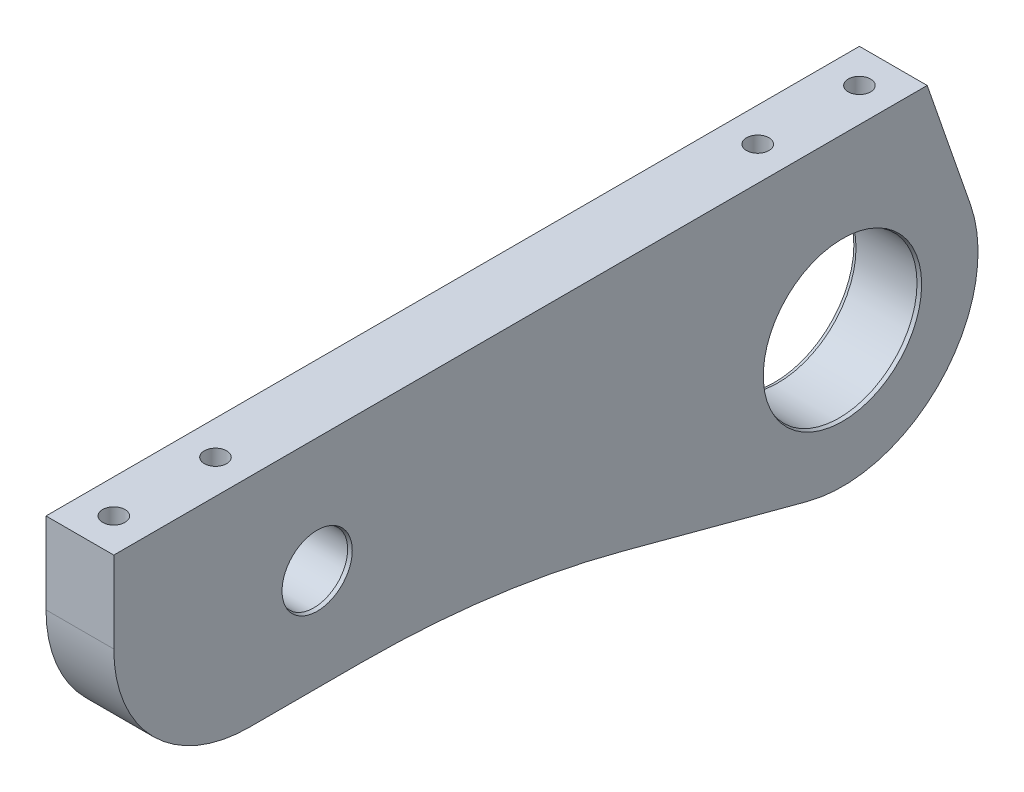
ISO-10303-21;
HEADER;
FILE_DESCRIPTION(('STEP AP214'),'2;1');
FILE_NAME('part.step','',(''),(''),'','','');
FILE_SCHEMA(('AUTOMOTIVE_DESIGN { 1 0 10303 214 1 1 1 1 }'));
ENDSEC;
DATA;
#1=APPLICATION_CONTEXT('core data for automotive mechanical design processes');
#2=APPLICATION_PROTOCOL_DEFINITION('international standard','automotive_design',2000,#1);
#3=PRODUCT_CONTEXT('',#1,'mechanical');
#4=PRODUCT('Part','Part','',(#3));
#5=PRODUCT_RELATED_PRODUCT_CATEGORY('part','',(#4));
#6=PRODUCT_DEFINITION_FORMATION('','',#4);
#7=PRODUCT_DEFINITION_CONTEXT('part definition',#1,'design');
#8=PRODUCT_DEFINITION('design','',#6,#7);
#9=PRODUCT_DEFINITION_SHAPE('','',#8);
#10=(LENGTH_UNIT() NAMED_UNIT(*) SI_UNIT(.MILLI.,.METRE.));
#11=(NAMED_UNIT(*) PLANE_ANGLE_UNIT() SI_UNIT($,.RADIAN.));
#12=(NAMED_UNIT(*) SI_UNIT($,.STERADIAN.) SOLID_ANGLE_UNIT());
#13=UNCERTAINTY_MEASURE_WITH_UNIT(LENGTH_MEASURE(1.E-05),#10,'distance_accuracy_value','');
#14=(GEOMETRIC_REPRESENTATION_CONTEXT(3) GLOBAL_UNCERTAINTY_ASSIGNED_CONTEXT((#13)) GLOBAL_UNIT_ASSIGNED_CONTEXT((#10,
#11,#12)) REPRESENTATION_CONTEXT('',''));
#15=CARTESIAN_POINT('',(0.,0.,0.));
#16=DIRECTION('',(0.,0.,1.));
#17=DIRECTION('',(1.,0.,0.));
#18=AXIS2_PLACEMENT_3D('',#15,#16,#17);
#19=CARTESIAN_POINT('',(5.,0.,60.));
#20=DIRECTION('',(0.,0.,-1.));
#21=DIRECTION('',(-1.,0.,0.));
#22=AXIS2_PLACEMENT_3D('',#19,#20,#21);
#23=PLANE('',#22);
#24=DIRECTION('',(0.,-1.,0.));
#25=VECTOR('',#24,1.);
#26=CARTESIAN_POINT('',(-5.,0.,60.));
#27=LINE('',#26,#25);
#28=CARTESIAN_POINT('',(-5.,0.,60.));
#29=VERTEX_POINT('',#28);
#30=CARTESIAN_POINT('',(-5.,-12.,60.));
#31=VERTEX_POINT('',#30);
#32=EDGE_CURVE('E203',#29,#31,#27,.T.);
#33=ORIENTED_EDGE('',*,*,#32,.T.);
#34=DIRECTION('',(-1.,0.,0.));
#35=VECTOR('',#34,1.);
#36=CARTESIAN_POINT('',(5.,-12.,60.));
#37=LINE('',#36,#35);
#38=CARTESIAN_POINT('',(5.,-12.,60.));
#39=VERTEX_POINT('',#38);
#40=EDGE_CURVE('E80',#31,#39,#37,.F.);
#41=ORIENTED_EDGE('',*,*,#40,.T.);
#42=DIRECTION('',(0.,-1.,0.));
#43=VECTOR('',#42,1.);
#44=CARTESIAN_POINT('',(5.,0.,60.));
#45=LINE('',#44,#43);
#46=CARTESIAN_POINT('',(5.,0.,60.));
#47=VERTEX_POINT('',#46);
#48=EDGE_CURVE('E204',#47,#39,#45,.T.);
#49=ORIENTED_EDGE('',*,*,#48,.F.);
#50=DIRECTION('',(-1.,0.,0.));
#51=VECTOR('',#50,1.);
#52=CARTESIAN_POINT('',(5.,0.,60.));
#53=LINE('',#52,#51);
#54=EDGE_CURVE('E223',#47,#29,#53,.T.);
#55=ORIENTED_EDGE('',*,*,#54,.T.);
#56=EDGE_LOOP('',(#33,#41,#49,#55));
#57=FACE_BOUND('',#56,.T.);
#58=ADVANCED_FACE('F60',(#57),#23,.F.);
#59=CARTESIAN_POINT('',(5.,-32.,3.81635580879513));
#60=DIRECTION('',(0.,1.,0.));
#61=DIRECTION('',(0.,0.,1.));
#62=AXIS2_PLACEMENT_3D('',#59,#60,#61);
#63=PLANE('',#62);
#64=DIRECTION('',(0.,0.,-1.));
#65=VECTOR('',#64,1.);
#66=CARTESIAN_POINT('',(5.,-32.,3.81635580879513));
#67=LINE('',#66,#65);
#68=CARTESIAN_POINT('',(5.,-32.,40.));
#69=VERTEX_POINT('',#68);
#70=CARTESIAN_POINT('',(5.,-32.,23.4953371319268));
#71=VERTEX_POINT('',#70);
#72=EDGE_CURVE('E207',#69,#71,#67,.T.);
#73=ORIENTED_EDGE('',*,*,#72,.F.);
#74=DIRECTION('',(-1.,0.,0.));
#75=VECTOR('',#74,1.);
#76=CARTESIAN_POINT('',(5.,-32.,40.));
#77=LINE('',#76,#75);
#78=CARTESIAN_POINT('',(-5.,-32.,40.));
#79=VERTEX_POINT('',#78);
#80=EDGE_CURVE('E269',#69,#79,#77,.T.);
#81=ORIENTED_EDGE('',*,*,#80,.T.);
#82=DIRECTION('',(0.,0.,-1.));
#83=VECTOR('',#82,1.);
#84=CARTESIAN_POINT('',(-5.,-32.,3.81635580879513));
#85=LINE('',#84,#83);
#86=CARTESIAN_POINT('',(-5.,-32.,23.4953371319268));
#87=VERTEX_POINT('',#86);
#88=EDGE_CURVE('E226',#79,#87,#85,.T.);
#89=ORIENTED_EDGE('',*,*,#88,.T.);
#90=DIRECTION('',(-1.,0.,0.));
#91=VECTOR('',#90,1.);
#92=CARTESIAN_POINT('',(5.,-32.,23.4953371319268));
#93=LINE('',#92,#91);
#94=EDGE_CURVE('E258',#87,#71,#93,.F.);
#95=ORIENTED_EDGE('',*,*,#94,.T.);
#96=EDGE_LOOP('',(#73,#81,#89,#95));
#97=FACE_BOUND('',#96,.T.);
#98=ADVANCED_FACE('F319',(#97),#63,.F.);
#99=CARTESIAN_POINT('',(5.,-32.,3.81635580879513));
#100=DIRECTION('',(0.,0.966159141207897,-0.257946726787564));
#101=DIRECTION('',(0.,0.257946726787564,0.966159141207897));
#102=AXIS2_PLACEMENT_3D('',#99,#100,#101);
#103=PLANE('',#102);
#104=DIRECTION('',(0.,-0.257946726787564,-0.966159141207897));
#105=VECTOR('',#104,1.);
#106=CARTESIAN_POINT('',(5.,-32.,3.81635580879513));
#107=LINE('',#106,#105);
#108=CARTESIAN_POINT('',(5.,-37.0761288188154,-15.1966718862079));
#109=VERTEX_POINT('',#108);
#110=CARTESIAN_POINT('',(5.,-44.3231828241579,-42.3410654642487));
#111=VERTEX_POINT('',#110);
#112=EDGE_CURVE('E211',#109,#111,#107,.T.);
#113=ORIENTED_EDGE('',*,*,#112,.F.);
#114=DIRECTION('',(-1.,0.,0.));
#115=VECTOR('',#114,1.);
#116=CARTESIAN_POINT('',(-5.,-37.0761288188154,-15.1966718862079));
#117=LINE('',#116,#115);
#118=CARTESIAN_POINT('',(-5.,-37.0761288188154,-15.1966718862079));
#119=VERTEX_POINT('',#118);
#120=EDGE_CURVE('E254',#109,#119,#117,.T.);
#121=ORIENTED_EDGE('',*,*,#120,.T.);
#122=DIRECTION('',(0.,-0.257946726787564,-0.966159141207897));
#123=VECTOR('',#122,1.);
#124=CARTESIAN_POINT('',(-5.,-32.,3.81635580879513));
#125=LINE('',#124,#123);
#126=CARTESIAN_POINT('',(-5.,-44.3231828241579,-42.3410654642487));
#127=VERTEX_POINT('',#126);
#128=EDGE_CURVE('E229',#119,#127,#125,.T.);
#129=ORIENTED_EDGE('',*,*,#128,.T.);
#130=DIRECTION('',(-1.,0.,0.));
#131=VECTOR('',#130,1.);
#132=CARTESIAN_POINT('',(5.,-44.3231828241579,-42.3410654642487));
#133=LINE('',#132,#131);
#134=EDGE_CURVE('E250',#111,#127,#133,.T.);
#135=ORIENTED_EDGE('',*,*,#134,.F.);
#136=EDGE_LOOP('',(#113,#121,#129,#135));
#137=FACE_BOUND('',#136,.T.);
#138=ADVANCED_FACE('F325',(#137),#103,.F.);
#139=CARTESIAN_POINT('',(5.,-25.,-47.5));
#140=DIRECTION('',(-1.,0.,0.));
#141=DIRECTION('',(0.,0.,1.));
#142=AXIS2_PLACEMENT_3D('',#139,#140,#141);
#143=CYLINDRICAL_SURFACE('',#142,20.);
#144=CARTESIAN_POINT('',(-5.,-25.,-47.5));
#145=DIRECTION('',(1.,0.,0.));
#146=DIRECTION('',(0.,0.,-1.));
#147=AXIS2_PLACEMENT_3D('',#144,#145,#146);
#148=CIRCLE('',#147,20.);
#149=CARTESIAN_POINT('',(-5.,-18.4481997407253,-66.3963994814507));
#150=VERTEX_POINT('',#149);
#151=EDGE_CURVE('E232',#127,#150,#148,.T.);
#152=ORIENTED_EDGE('',*,*,#151,.T.);
#153=DIRECTION('',(-1.,0.,0.));
#154=VECTOR('',#153,1.);
#155=CARTESIAN_POINT('',(5.,-18.4481997407253,-66.3963994814507));
#156=LINE('',#155,#154);
#157=CARTESIAN_POINT('',(5.,-18.4481997407253,-66.3963994814507));
#158=VERTEX_POINT('',#157);
#159=EDGE_CURVE('E246',#158,#150,#156,.T.);
#160=ORIENTED_EDGE('',*,*,#159,.F.);
#161=CARTESIAN_POINT('',(5.,-25.,-47.5));
#162=DIRECTION('',(1.,0.,0.));
#163=DIRECTION('',(0.,0.,-1.));
#164=AXIS2_PLACEMENT_3D('',#161,#162,#163);
#165=CIRCLE('',#164,20.);
#166=EDGE_CURVE('E214',#111,#158,#165,.T.);
#167=ORIENTED_EDGE('',*,*,#166,.F.);
#168=ORIENTED_EDGE('',*,*,#134,.T.);
#169=EDGE_LOOP('',(#152,#160,#167,#168));
#170=FACE_BOUND('',#169,.T.);
#171=ADVANCED_FACE('F391',(#170),#143,.T.);
#172=CARTESIAN_POINT('',(5.,0.,-60.));
#173=DIRECTION('',(0.,-0.327590012963734,0.944819974072532));
#174=DIRECTION('',(0.,-0.944819974072532,-0.327590012963734));
#175=AXIS2_PLACEMENT_3D('',#172,#173,#174);
#176=PLANE('',#175);
#177=DIRECTION('',(0.,0.944819974072532,0.327590012963734));
#178=VECTOR('',#177,1.);
#179=CARTESIAN_POINT('',(-5.,0.,-60.));
#180=LINE('',#179,#178);
#181=CARTESIAN_POINT('',(-5.,0.,-60.));
#182=VERTEX_POINT('',#181);
#183=EDGE_CURVE('E235',#150,#182,#180,.T.);
#184=ORIENTED_EDGE('',*,*,#183,.T.);
#185=DIRECTION('',(-1.,0.,0.));
#186=VECTOR('',#185,1.);
#187=CARTESIAN_POINT('',(5.,0.,-60.));
#188=LINE('',#187,#186);
#189=CARTESIAN_POINT('',(5.,0.,-60.));
#190=VERTEX_POINT('',#189);
#191=EDGE_CURVE('E242',#190,#182,#188,.T.);
#192=ORIENTED_EDGE('',*,*,#191,.F.);
#193=DIRECTION('',(0.,0.944819974072532,0.327590012963734));
#194=VECTOR('',#193,1.);
#195=CARTESIAN_POINT('',(5.,0.,-60.));
#196=LINE('',#195,#194);
#197=EDGE_CURVE('E217',#158,#190,#196,.T.);
#198=ORIENTED_EDGE('',*,*,#197,.F.);
#199=ORIENTED_EDGE('',*,*,#159,.T.);
#200=EDGE_LOOP('',(#184,#192,#198,#199));
#201=FACE_BOUND('',#200,.T.);
#202=ADVANCED_FACE('F387',(#201),#176,.F.);
#203=CARTESIAN_POINT('',(5.,0.,60.));
#204=DIRECTION('',(0.,-1.,0.));
#205=DIRECTION('',(0.,0.,-1.));
#206=AXIS2_PLACEMENT_3D('',#203,#204,#205);
#207=PLANE('',#206);
#208=CARTESIAN_POINT('',(0.,0.,55.));
#209=DIRECTION('',(0.,1.,0.));
#210=DIRECTION('',(0.,0.,1.));
#211=AXIS2_PLACEMENT_3D('',#208,#209,#210);
#212=CIRCLE('',#211,1.65);
#213=CARTESIAN_POINT('',(0.,0.,56.65));
#214=VERTEX_POINT('',#213);
#215=EDGE_CURVE('E171',#214,#214,#212,.T.);
#216=ORIENTED_EDGE('',*,*,#215,.F.);
#217=EDGE_LOOP('',(#216));
#218=FACE_BOUND('',#217,.T.);
#219=CARTESIAN_POINT('',(0.,0.,40.));
#220=DIRECTION('',(0.,1.,0.));
#221=DIRECTION('',(0.,0.,1.));
#222=AXIS2_PLACEMENT_3D('',#219,#220,#221);
#223=CIRCLE('',#222,1.65);
#224=CARTESIAN_POINT('',(0.,0.,41.65));
#225=VERTEX_POINT('',#224);
#226=EDGE_CURVE('E170',#225,#225,#223,.T.);
#227=ORIENTED_EDGE('',*,*,#226,.F.);
#228=EDGE_LOOP('',(#227));
#229=FACE_BOUND('',#228,.T.);
#230=CARTESIAN_POINT('',(0.,0.,-40.));
#231=DIRECTION('',(0.,1.,0.));
#232=DIRECTION('',(0.,0.,1.));
#233=AXIS2_PLACEMENT_3D('',#230,#231,#232);
#234=CIRCLE('',#233,1.65);
#235=CARTESIAN_POINT('',(0.,0.,-38.35));
#236=VERTEX_POINT('',#235);
#237=EDGE_CURVE('E187',#236,#236,#234,.T.);
#238=ORIENTED_EDGE('',*,*,#237,.F.);
#239=EDGE_LOOP('',(#238));
#240=FACE_BOUND('',#239,.T.);
#241=CARTESIAN_POINT('',(0.,0.,-55.));
#242=DIRECTION('',(0.,1.,0.));
#243=DIRECTION('',(0.,0.,1.));
#244=AXIS2_PLACEMENT_3D('',#241,#242,#243);
#245=CIRCLE('',#244,1.65);
#246=CARTESIAN_POINT('',(0.,0.,-53.35));
#247=VERTEX_POINT('',#246);
#248=EDGE_CURVE('E195',#247,#247,#245,.T.);
#249=ORIENTED_EDGE('',*,*,#248,.F.);
#250=EDGE_LOOP('',(#249));
#251=FACE_BOUND('',#250,.T.);
#252=DIRECTION('',(0.,0.,1.));
#253=VECTOR('',#252,1.);
#254=CARTESIAN_POINT('',(-5.,0.,60.));
#255=LINE('',#254,#253);
#256=EDGE_CURVE('E208',#182,#29,#255,.T.);
#257=ORIENTED_EDGE('',*,*,#256,.T.);
#258=ORIENTED_EDGE('',*,*,#54,.F.);
#259=DIRECTION('',(0.,0.,1.));
#260=VECTOR('',#259,1.);
#261=CARTESIAN_POINT('',(5.,0.,60.));
#262=LINE('',#261,#260);
#263=EDGE_CURVE('E220',#190,#47,#262,.T.);
#264=ORIENTED_EDGE('',*,*,#263,.F.);
#265=ORIENTED_EDGE('',*,*,#191,.T.);
#266=EDGE_LOOP('',(#257,#258,#264,#265));
#267=FACE_BOUND('',#266,.T.);
#268=ADVANCED_FACE('F382',(#218,#229,#240,#251,#267),#207,.F.);
#269=CARTESIAN_POINT('',(5.,-25.,-47.5));
#270=DIRECTION('',(1.,0.,0.));
#271=DIRECTION('',(0.,0.,-1.));
#272=AXIS2_PLACEMENT_3D('',#269,#270,#271);
#273=PLANE('',#272);
#274=CARTESIAN_POINT('',(5.,-25.,-47.5));
#275=DIRECTION('',(1.,0.,0.));
#276=DIRECTION('',(0.,0.,-1.));
#277=AXIS2_PLACEMENT_3D('',#274,#275,#276);
#278=CIRCLE('',#277,11.6819851171331);
#279=CARTESIAN_POINT('',(5.,-25.,-59.1819851171331));
#280=VERTEX_POINT('',#279);
#281=EDGE_CURVE('E299',#280,#280,#278,.F.);
#282=ORIENTED_EDGE('',*,*,#281,.T.);
#283=EDGE_LOOP('',(#282));
#284=FACE_BOUND('',#283,.T.);
#285=CARTESIAN_POINT('',(5.,-17.,30.));
#286=DIRECTION('',(1.,0.,0.));
#287=DIRECTION('',(0.,0.,-1.));
#288=AXIS2_PLACEMENT_3D('',#285,#286,#287);
#289=CIRCLE('',#288,5.1819851171331);
#290=CARTESIAN_POINT('',(5.,-17.,24.8180148828669));
#291=VERTEX_POINT('',#290);
#292=EDGE_CURVE('E295',#291,#291,#289,.F.);
#293=ORIENTED_EDGE('',*,*,#292,.T.);
#294=EDGE_LOOP('',(#293));
#295=FACE_BOUND('',#294,.T.);
#296=ORIENTED_EDGE('',*,*,#48,.T.);
#297=CARTESIAN_POINT('',(5.,-12.,40.));
#298=DIRECTION('',(1.,0.,0.));
#299=DIRECTION('',(0.,0.,-1.));
#300=AXIS2_PLACEMENT_3D('',#297,#298,#299);
#301=CIRCLE('',#300,20.);
#302=EDGE_CURVE('E276',#39,#69,#301,.T.);
#303=ORIENTED_EDGE('',*,*,#302,.T.);
#304=ORIENTED_EDGE('',*,*,#72,.T.);
#305=CARTESIAN_POINT('',(5.,-182.,23.4953371319268));
#306=DIRECTION('',(1.,0.,0.));
#307=DIRECTION('',(0.,0.,-1.));
#308=AXIS2_PLACEMENT_3D('',#305,#306,#307);
#309=CIRCLE('',#308,150.);
#310=EDGE_CURVE('E266',#71,#109,#309,.F.);
#311=ORIENTED_EDGE('',*,*,#310,.T.);
#312=ORIENTED_EDGE('',*,*,#112,.T.);
#313=ORIENTED_EDGE('',*,*,#166,.T.);
#314=ORIENTED_EDGE('',*,*,#197,.T.);
#315=ORIENTED_EDGE('',*,*,#263,.T.);
#316=EDGE_LOOP('',(#296,#303,#304,#311,#312,#313,#314,#315));
#317=FACE_BOUND('',#316,.T.);
#318=ADVANCED_FACE('F376',(#284,#295,#317),#273,.T.);
#319=CARTESIAN_POINT('',(-5.,-25.,-47.5));
#320=DIRECTION('',(1.,0.,0.));
#321=DIRECTION('',(0.,0.,-1.));
#322=AXIS2_PLACEMENT_3D('',#319,#320,#321);
#323=PLANE('',#322);
#324=CARTESIAN_POINT('',(-5.,-25.,-47.5));
#325=DIRECTION('',(1.,0.,0.));
#326=DIRECTION('',(0.,0.,-1.));
#327=AXIS2_PLACEMENT_3D('',#324,#325,#326);
#328=CIRCLE('',#327,11.6819851171331);
#329=CARTESIAN_POINT('',(-5.,-25.,-59.1819851171331));
#330=VERTEX_POINT('',#329);
#331=EDGE_CURVE('E283',#330,#330,#328,.T.);
#332=ORIENTED_EDGE('',*,*,#331,.T.);
#333=EDGE_LOOP('',(#332));
#334=FACE_BOUND('',#333,.T.);
#335=CARTESIAN_POINT('',(-5.,-17.,30.));
#336=DIRECTION('',(1.,0.,0.));
#337=DIRECTION('',(0.,0.,-1.));
#338=AXIS2_PLACEMENT_3D('',#335,#336,#337);
#339=CIRCLE('',#338,5.1819851171331);
#340=CARTESIAN_POINT('',(-5.,-17.,24.8180148828669));
#341=VERTEX_POINT('',#340);
#342=EDGE_CURVE('E279',#341,#341,#339,.T.);
#343=ORIENTED_EDGE('',*,*,#342,.T.);
#344=EDGE_LOOP('',(#343));
#345=FACE_BOUND('',#344,.T.);
#346=ORIENTED_EDGE('',*,*,#88,.F.);
#347=CARTESIAN_POINT('',(-5.,-12.,40.));
#348=DIRECTION('',(1.,0.,0.));
#349=DIRECTION('',(0.,0.,-1.));
#350=AXIS2_PLACEMENT_3D('',#347,#348,#349);
#351=CIRCLE('',#350,20.);
#352=EDGE_CURVE('E90',#79,#31,#351,.F.);
#353=ORIENTED_EDGE('',*,*,#352,.T.);
#354=ORIENTED_EDGE('',*,*,#32,.F.);
#355=ORIENTED_EDGE('',*,*,#256,.F.);
#356=ORIENTED_EDGE('',*,*,#183,.F.);
#357=ORIENTED_EDGE('',*,*,#151,.F.);
#358=ORIENTED_EDGE('',*,*,#128,.F.);
#359=CARTESIAN_POINT('',(-5.,-182.,23.4953371319268));
#360=DIRECTION('',(1.,0.,0.));
#361=DIRECTION('',(0.,0.,-1.));
#362=AXIS2_PLACEMENT_3D('',#359,#360,#361);
#363=CIRCLE('',#362,150.);
#364=EDGE_CURVE('E262',#119,#87,#363,.T.);
#365=ORIENTED_EDGE('',*,*,#364,.T.);
#366=EDGE_LOOP('',(#346,#353,#354,#355,#356,#357,#358,#365));
#367=FACE_BOUND('',#366,.T.);
#368=ADVANCED_FACE('F364',(#334,#345,#367),#323,.F.);
#369=CARTESIAN_POINT('',(-5.,-25.,-47.5));
#370=DIRECTION('',(1.,0.,0.));
#371=DIRECTION('',(0.,0.,-1.));
#372=AXIS2_PLACEMENT_3D('',#369,#370,#371);
#373=CYLINDRICAL_SURFACE('',#372,11.5);
#374=CARTESIAN_POINT('',(-4.49999999999996,-25.,-47.5));
#375=DIRECTION('',(1.,0.,0.));
#376=DIRECTION('',(0.,0.,-1.));
#377=AXIS2_PLACEMENT_3D('',#374,#375,#376);
#378=CIRCLE('',#377,11.5);
#379=CARTESIAN_POINT('',(-4.49999999999996,-25.,-59.));
#380=VERTEX_POINT('',#379);
#381=EDGE_CURVE('E291',#380,#380,#378,.F.);
#382=ORIENTED_EDGE('',*,*,#381,.T.);
#383=EDGE_LOOP('',(#382));
#384=FACE_BOUND('',#383,.T.);
#385=CARTESIAN_POINT('',(4.49999999999996,-25.,-47.5));
#386=DIRECTION('',(1.,0.,0.));
#387=DIRECTION('',(0.,0.,-1.));
#388=AXIS2_PLACEMENT_3D('',#385,#386,#387);
#389=CIRCLE('',#388,11.5);
#390=CARTESIAN_POINT('',(4.49999999999996,-25.,-59.));
#391=VERTEX_POINT('',#390);
#392=EDGE_CURVE('E287',#391,#391,#389,.T.);
#393=ORIENTED_EDGE('',*,*,#392,.T.);
#394=EDGE_LOOP('',(#393));
#395=FACE_BOUND('',#394,.T.);
#396=ADVANCED_FACE('F361',(#384,#395),#373,.F.);
#397=CARTESIAN_POINT('',(0.,-11.5,-55.));
#398=DIRECTION('',(0.,1.,0.));
#399=DIRECTION('',(0.,0.,1.));
#400=AXIS2_PLACEMENT_3D('',#397,#398,#399);
#401=CONICAL_SURFACE('',#400,1.65,1.02974425867665);
#402=CARTESIAN_POINT('',(0.,-12.4914200213955,-55.));
#403=VERTEX_POINT('',#402);
#404=VERTEX_LOOP('',#403);
#405=FACE_BOUND('',#404,.T.);
#406=CARTESIAN_POINT('',(0.,-11.5,-55.));
#407=DIRECTION('',(0.,1.,0.));
#408=DIRECTION('',(0.,0.,1.));
#409=AXIS2_PLACEMENT_3D('',#406,#407,#408);
#410=CIRCLE('',#409,1.65);
#411=CARTESIAN_POINT('',(0.,-11.5,-53.35));
#412=VERTEX_POINT('',#411);
#413=EDGE_CURVE('E199',#412,#412,#410,.T.);
#414=ORIENTED_EDGE('',*,*,#413,.T.);
#415=EDGE_LOOP('',(#414));
#416=FACE_BOUND('',#415,.T.);
#417=ADVANCED_FACE('F363',(#405,#416),#401,.F.);
#418=CARTESIAN_POINT('',(0.,0.,-55.));
#419=DIRECTION('',(0.,1.,0.));
#420=DIRECTION('',(0.,0.,1.));
#421=AXIS2_PLACEMENT_3D('',#418,#419,#420);
#422=CYLINDRICAL_SURFACE('',#421,1.65);
#423=ORIENTED_EDGE('',*,*,#413,.F.);
#424=EDGE_LOOP('',(#423));
#425=FACE_BOUND('',#424,.T.);
#426=ORIENTED_EDGE('',*,*,#248,.T.);
#427=EDGE_LOOP('',(#426));
#428=FACE_BOUND('',#427,.T.);
#429=ADVANCED_FACE('F372',(#425,#428),#422,.F.);
#430=CARTESIAN_POINT('',(0.,-11.5,-40.));
#431=DIRECTION('',(0.,1.,0.));
#432=DIRECTION('',(0.,0.,1.));
#433=AXIS2_PLACEMENT_3D('',#430,#431,#432);
#434=CONICAL_SURFACE('',#433,1.65,1.02974425867665);
#435=CARTESIAN_POINT('',(0.,-12.4914200213955,-40.));
#436=VERTEX_POINT('',#435);
#437=VERTEX_LOOP('',#436);
#438=FACE_BOUND('',#437,.T.);
#439=CARTESIAN_POINT('',(0.,-11.5,-40.));
#440=DIRECTION('',(0.,1.,0.));
#441=DIRECTION('',(0.,0.,1.));
#442=AXIS2_PLACEMENT_3D('',#439,#440,#441);
#443=CIRCLE('',#442,1.65);
#444=CARTESIAN_POINT('',(0.,-11.5,-38.35));
#445=VERTEX_POINT('',#444);
#446=EDGE_CURVE('E191',#445,#445,#443,.T.);
#447=ORIENTED_EDGE('',*,*,#446,.T.);
#448=EDGE_LOOP('',(#447));
#449=FACE_BOUND('',#448,.T.);
#450=ADVANCED_FACE('F448',(#438,#449),#434,.F.);
#451=CARTESIAN_POINT('',(0.,0.,-40.));
#452=DIRECTION('',(0.,1.,0.));
#453=DIRECTION('',(0.,0.,1.));
#454=AXIS2_PLACEMENT_3D('',#451,#452,#453);
#455=CYLINDRICAL_SURFACE('',#454,1.65);
#456=ORIENTED_EDGE('',*,*,#446,.F.);
#457=EDGE_LOOP('',(#456));
#458=FACE_BOUND('',#457,.T.);
#459=ORIENTED_EDGE('',*,*,#237,.T.);
#460=EDGE_LOOP('',(#459));
#461=FACE_BOUND('',#460,.T.);
#462=ADVANCED_FACE('F456',(#458,#461),#455,.F.);
#463=CARTESIAN_POINT('',(0.,-11.5,40.));
#464=DIRECTION('',(0.,1.,0.));
#465=DIRECTION('',(0.,0.,1.));
#466=AXIS2_PLACEMENT_3D('',#463,#464,#465);
#467=CONICAL_SURFACE('',#466,1.65,1.02974425867665);
#468=CARTESIAN_POINT('',(0.,-12.4914200213955,40.));
#469=VERTEX_POINT('',#468);
#470=VERTEX_LOOP('',#469);
#471=FACE_BOUND('',#470,.T.);
#472=CARTESIAN_POINT('',(0.,-11.5,40.));
#473=DIRECTION('',(0.,1.,0.));
#474=DIRECTION('',(0.,0.,1.));
#475=AXIS2_PLACEMENT_3D('',#472,#473,#474);
#476=CIRCLE('',#475,1.65);
#477=CARTESIAN_POINT('',(0.,-11.5,41.65));
#478=VERTEX_POINT('',#477);
#479=EDGE_CURVE('E178',#478,#478,#476,.T.);
#480=ORIENTED_EDGE('',*,*,#479,.T.);
#481=EDGE_LOOP('',(#480));
#482=FACE_BOUND('',#481,.T.);
#483=ADVANCED_FACE('F461',(#471,#482),#467,.F.);
#484=CARTESIAN_POINT('',(0.,0.,40.));
#485=DIRECTION('',(0.,1.,0.));
#486=DIRECTION('',(0.,0.,1.));
#487=AXIS2_PLACEMENT_3D('',#484,#485,#486);
#488=CYLINDRICAL_SURFACE('',#487,1.65);
#489=ORIENTED_EDGE('',*,*,#479,.F.);
#490=EDGE_LOOP('',(#489));
#491=FACE_BOUND('',#490,.T.);
#492=ORIENTED_EDGE('',*,*,#226,.T.);
#493=EDGE_LOOP('',(#492));
#494=FACE_BOUND('',#493,.T.);
#495=ADVANCED_FACE('F163',(#491,#494),#488,.F.);
#496=CARTESIAN_POINT('',(0.,-11.5,55.));
#497=DIRECTION('',(0.,1.,0.));
#498=DIRECTION('',(0.,0.,1.));
#499=AXIS2_PLACEMENT_3D('',#496,#497,#498);
#500=CONICAL_SURFACE('',#499,1.65,1.02974425867665);
#501=CARTESIAN_POINT('',(0.,-12.4914200213955,55.));
#502=VERTEX_POINT('',#501);
#503=VERTEX_LOOP('',#502);
#504=FACE_BOUND('',#503,.T.);
#505=CARTESIAN_POINT('',(0.,-11.5,55.));
#506=DIRECTION('',(0.,1.,0.));
#507=DIRECTION('',(0.,0.,1.));
#508=AXIS2_PLACEMENT_3D('',#505,#506,#507);
#509=CIRCLE('',#508,1.65);
#510=CARTESIAN_POINT('',(0.,-11.5,56.65));
#511=VERTEX_POINT('',#510);
#512=EDGE_CURVE('E167',#511,#511,#509,.T.);
#513=ORIENTED_EDGE('',*,*,#512,.T.);
#514=EDGE_LOOP('',(#513));
#515=FACE_BOUND('',#514,.T.);
#516=ADVANCED_FACE('F159',(#504,#515),#500,.F.);
#517=CARTESIAN_POINT('',(0.,0.,55.));
#518=DIRECTION('',(0.,1.,0.));
#519=DIRECTION('',(0.,0.,1.));
#520=AXIS2_PLACEMENT_3D('',#517,#518,#519);
#521=CYLINDRICAL_SURFACE('',#520,1.65);
#522=ORIENTED_EDGE('',*,*,#512,.F.);
#523=EDGE_LOOP('',(#522));
#524=FACE_BOUND('',#523,.T.);
#525=ORIENTED_EDGE('',*,*,#215,.T.);
#526=EDGE_LOOP('',(#525));
#527=FACE_BOUND('',#526,.T.);
#528=ADVANCED_FACE('F162',(#524,#527),#521,.F.);
#529=CARTESIAN_POINT('',(-5.,-17.,30.));
#530=DIRECTION('',(1.,0.,0.));
#531=DIRECTION('',(0.,0.,-1.));
#532=AXIS2_PLACEMENT_3D('',#529,#530,#531);
#533=CYLINDRICAL_SURFACE('',#532,5.);
#534=CARTESIAN_POINT('',(-4.50000000000001,-17.,30.));
#535=DIRECTION('',(1.,0.,0.));
#536=DIRECTION('',(0.,0.,-1.));
#537=AXIS2_PLACEMENT_3D('',#534,#535,#536);
#538=CIRCLE('',#537,5.);
#539=CARTESIAN_POINT('',(-4.50000000000001,-17.,25.));
#540=VERTEX_POINT('',#539);
#541=EDGE_CURVE('E11',#540,#540,#538,.F.);
#542=ORIENTED_EDGE('',*,*,#541,.T.);
#543=EDGE_LOOP('',(#542));
#544=FACE_BOUND('',#543,.T.);
#545=CARTESIAN_POINT('',(4.50000000000001,-17.,30.));
#546=DIRECTION('',(1.,0.,0.));
#547=DIRECTION('',(0.,0.,-1.));
#548=AXIS2_PLACEMENT_3D('',#545,#546,#547);
#549=CIRCLE('',#548,5.);
#550=CARTESIAN_POINT('',(4.50000000000001,-17.,25.));
#551=VERTEX_POINT('',#550);
#552=EDGE_CURVE('E70',#551,#551,#549,.T.);
#553=ORIENTED_EDGE('',*,*,#552,.T.);
#554=EDGE_LOOP('',(#553));
#555=FACE_BOUND('',#554,.T.);
#556=ADVANCED_FACE('F307',(#544,#555),#533,.F.);
#557=CARTESIAN_POINT('',(5.,-182.,23.4953371319268));
#558=DIRECTION('',(1.,0.,0.));
#559=DIRECTION('',(0.,0.,-1.));
#560=AXIS2_PLACEMENT_3D('',#557,#558,#559);
#561=CYLINDRICAL_SURFACE('',#560,150.);
#562=ORIENTED_EDGE('',*,*,#310,.F.);
#563=ORIENTED_EDGE('',*,*,#94,.F.);
#564=ORIENTED_EDGE('',*,*,#364,.F.);
#565=ORIENTED_EDGE('',*,*,#120,.F.);
#566=EDGE_LOOP('',(#562,#563,#564,#565));
#567=FACE_BOUND('',#566,.T.);
#568=ADVANCED_FACE('F330',(#567),#561,.F.);
#569=CARTESIAN_POINT('',(5.,-12.,40.));
#570=DIRECTION('',(-1.,0.,0.));
#571=DIRECTION('',(0.,0.,1.));
#572=AXIS2_PLACEMENT_3D('',#569,#570,#571);
#573=CYLINDRICAL_SURFACE('',#572,20.);
#574=ORIENTED_EDGE('',*,*,#302,.F.);
#575=ORIENTED_EDGE('',*,*,#40,.F.);
#576=ORIENTED_EDGE('',*,*,#352,.F.);
#577=ORIENTED_EDGE('',*,*,#80,.F.);
#578=EDGE_LOOP('',(#574,#575,#576,#577));
#579=FACE_BOUND('',#578,.T.);
#580=ADVANCED_FACE('F333',(#579),#573,.T.);
#581=CARTESIAN_POINT('',(-5.,-25.,-47.5));
#582=DIRECTION('',(-1.,0.,0.));
#583=DIRECTION('',(0.,0.,1.));
#584=AXIS2_PLACEMENT_3D('',#581,#582,#583);
#585=CONICAL_SURFACE('',#584,11.6819851171331,0.349065850398866);
#586=ORIENTED_EDGE('',*,*,#381,.F.);
#587=EDGE_LOOP('',(#586));
#588=FACE_BOUND('',#587,.T.);
#589=ORIENTED_EDGE('',*,*,#331,.F.);
#590=EDGE_LOOP('',(#589));
#591=FACE_BOUND('',#590,.T.);
#592=ADVANCED_FACE('F337',(#588,#591),#585,.F.);
#593=CARTESIAN_POINT('',(4.49999999999996,-25.,-47.5));
#594=DIRECTION('',(1.,0.,0.));
#595=DIRECTION('',(0.,0.,-1.));
#596=AXIS2_PLACEMENT_3D('',#593,#594,#595);
#597=CONICAL_SURFACE('',#596,11.5,0.349065850398866);
#598=ORIENTED_EDGE('',*,*,#281,.F.);
#599=EDGE_LOOP('',(#598));
#600=FACE_BOUND('',#599,.T.);
#601=ORIENTED_EDGE('',*,*,#392,.F.);
#602=EDGE_LOOP('',(#601));
#603=FACE_BOUND('',#602,.T.);
#604=ADVANCED_FACE('F315',(#600,#603),#597,.F.);
#605=CARTESIAN_POINT('',(-5.,-17.,30.));
#606=DIRECTION('',(-1.,0.,0.));
#607=DIRECTION('',(0.,0.,1.));
#608=AXIS2_PLACEMENT_3D('',#605,#606,#607);
#609=CONICAL_SURFACE('',#608,5.1819851171331,0.349065850398862);
#610=ORIENTED_EDGE('',*,*,#541,.F.);
#611=EDGE_LOOP('',(#610));
#612=FACE_BOUND('',#611,.T.);
#613=ORIENTED_EDGE('',*,*,#342,.F.);
#614=EDGE_LOOP('',(#613));
#615=FACE_BOUND('',#614,.T.);
#616=ADVANCED_FACE('F310',(#612,#615),#609,.F.);
#617=CARTESIAN_POINT('',(4.50000000000001,-17.,30.));
#618=DIRECTION('',(1.,0.,0.));
#619=DIRECTION('',(0.,0.,-1.));
#620=AXIS2_PLACEMENT_3D('',#617,#618,#619);
#621=CONICAL_SURFACE('',#620,5.,0.349065850398862);
#622=ORIENTED_EDGE('',*,*,#292,.F.);
#623=EDGE_LOOP('',(#622));
#624=FACE_BOUND('',#623,.T.);
#625=ORIENTED_EDGE('',*,*,#552,.F.);
#626=EDGE_LOOP('',(#625));
#627=FACE_BOUND('',#626,.T.);
#628=ADVANCED_FACE('F63',(#624,#627),#621,.F.);
#629=CLOSED_SHELL('',(#58,#98,#138,#171,#202,#268,#318,#368,#396,#417,#429,#450,#462,#483,#495,
#516,#528,#556,#568,#580,#592,#604,#616,#628));
#630=MANIFOLD_SOLID_BREP('B2',#629);
#631=ADVANCED_BREP_SHAPE_REPRESENTATION('',(#18,#630),#14);
#632=SHAPE_DEFINITION_REPRESENTATION(#9,#631);
ENDSEC;
END-ISO-10303-21;
